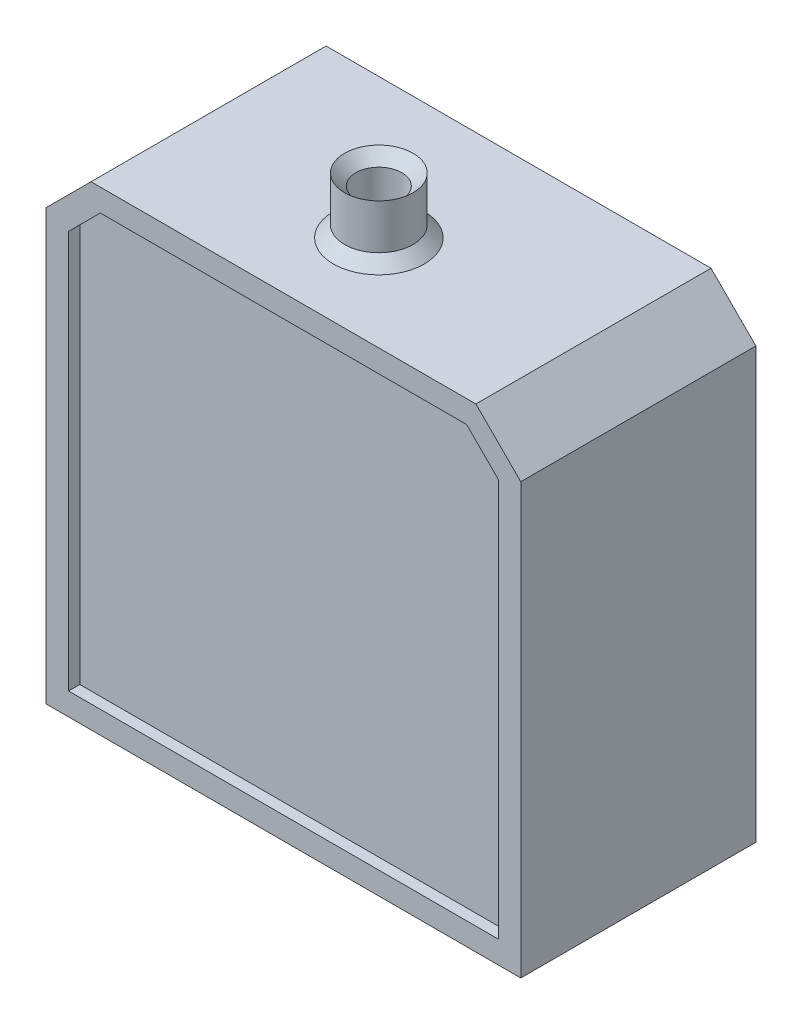
ISO-10303-21;
HEADER;
FILE_DESCRIPTION(('STEP AP214'),'2;1');
FILE_NAME('part.step','',(''),(''),'','','');
FILE_SCHEMA(('AUTOMOTIVE_DESIGN { 1 0 10303 214 1 1 1 1 }'));
ENDSEC;
DATA;
#1=APPLICATION_CONTEXT('core data for automotive mechanical design processes');
#2=APPLICATION_PROTOCOL_DEFINITION('international standard','automotive_design',2000,#1);
#3=PRODUCT_CONTEXT('',#1,'mechanical');
#4=PRODUCT('Part','Part','',(#3));
#5=PRODUCT_RELATED_PRODUCT_CATEGORY('part','',(#4));
#6=PRODUCT_DEFINITION_FORMATION('','',#4);
#7=PRODUCT_DEFINITION_CONTEXT('part definition',#1,'design');
#8=PRODUCT_DEFINITION('design','',#6,#7);
#9=PRODUCT_DEFINITION_SHAPE('','',#8);
#10=(LENGTH_UNIT() NAMED_UNIT(*) SI_UNIT(.MILLI.,.METRE.));
#11=(NAMED_UNIT(*) PLANE_ANGLE_UNIT() SI_UNIT($,.RADIAN.));
#12=(NAMED_UNIT(*) SI_UNIT($,.STERADIAN.) SOLID_ANGLE_UNIT());
#13=UNCERTAINTY_MEASURE_WITH_UNIT(LENGTH_MEASURE(1.E-05),#10,'distance_accuracy_value','');
#14=(GEOMETRIC_REPRESENTATION_CONTEXT(3) GLOBAL_UNCERTAINTY_ASSIGNED_CONTEXT((#13)) GLOBAL_UNIT_ASSIGNED_CONTEXT((#10,
#11,#12)) REPRESENTATION_CONTEXT('',''));
#15=CARTESIAN_POINT('',(0.,0.,0.));
#16=DIRECTION('',(0.,0.,1.));
#17=DIRECTION('',(1.,0.,0.));
#18=AXIS2_PLACEMENT_3D('',#15,#16,#17);
#19=CARTESIAN_POINT('',(-21.15,21.15,20.95));
#20=DIRECTION('',(0.,-1.,0.));
#21=DIRECTION('',(0.,0.,-1.));
#22=AXIS2_PLACEMENT_3D('',#19,#20,#21);
#23=PLANE('',#22);
#24=CARTESIAN_POINT('',(0.,21.15,12.45));
#25=DIRECTION('',(0.,-1.,0.));
#26=DIRECTION('',(0.,0.,-1.));
#27=AXIS2_PLACEMENT_3D('',#24,#25,#26);
#28=CIRCLE('',#27,4.04999999999999);
#29=CARTESIAN_POINT('',(0.,21.15,8.40000000000001));
#30=VERTEX_POINT('',#29);
#31=EDGE_CURVE('E44',#30,#30,#28,.T.);
#32=ORIENTED_EDGE('',*,*,#31,.T.);
#33=EDGE_LOOP('',(#32));
#34=FACE_BOUND('',#33,.T.);
#35=DIRECTION('',(-1.,0.,0.));
#36=VECTOR('',#35,1.);
#37=CARTESIAN_POINT('',(-21.15,21.15,20.95));
#38=LINE('',#37,#36);
#39=CARTESIAN_POINT('',(17.15,21.15,20.95));
#40=VERTEX_POINT('',#39);
#41=CARTESIAN_POINT('',(-17.15,21.15,20.95));
#42=VERTEX_POINT('',#41);
#43=EDGE_CURVE('E199',#40,#42,#38,.T.);
#44=ORIENTED_EDGE('',*,*,#43,.F.);
#45=DIRECTION('',(0.,0.,-1.));
#46=VECTOR('',#45,1.);
#47=CARTESIAN_POINT('',(17.15,21.15,20.95));
#48=LINE('',#47,#46);
#49=CARTESIAN_POINT('',(17.15,21.15,0.));
#50=VERTEX_POINT('',#49);
#51=EDGE_CURVE('E225',#40,#50,#48,.T.);
#52=ORIENTED_EDGE('',*,*,#51,.T.);
#53=DIRECTION('',(-1.,0.,0.));
#54=VECTOR('',#53,1.);
#55=CARTESIAN_POINT('',(-21.15,21.15,0.));
#56=LINE('',#55,#54);
#57=CARTESIAN_POINT('',(-17.15,21.15,0.));
#58=VERTEX_POINT('',#57);
#59=EDGE_CURVE('E196',#50,#58,#56,.T.);
#60=ORIENTED_EDGE('',*,*,#59,.T.);
#61=DIRECTION('',(0.,0.,1.));
#62=VECTOR('',#61,1.);
#63=CARTESIAN_POINT('',(-17.15,21.15,20.95));
#64=LINE('',#63,#62);
#65=EDGE_CURVE('E223',#58,#42,#64,.T.);
#66=ORIENTED_EDGE('',*,*,#65,.T.);
#67=EDGE_LOOP('',(#44,#52,#60,#66));
#68=FACE_BOUND('',#67,.T.);
#69=ADVANCED_FACE('F36',(#34,#68),#23,.F.);
#70=CARTESIAN_POINT('',(-21.15,-21.15,20.95));
#71=DIRECTION('',(1.,0.,0.));
#72=DIRECTION('',(0.,0.,-1.));
#73=AXIS2_PLACEMENT_3D('',#70,#71,#72);
#74=PLANE('',#73);
#75=DIRECTION('',(0.,-1.,0.));
#76=VECTOR('',#75,1.);
#77=CARTESIAN_POINT('',(-21.15,-21.15,20.95));
#78=LINE('',#77,#76);
#79=CARTESIAN_POINT('',(-21.15,17.15,20.95));
#80=VERTEX_POINT('',#79);
#81=CARTESIAN_POINT('',(-21.15,-21.15,20.95));
#82=VERTEX_POINT('',#81);
#83=EDGE_CURVE('E201',#80,#82,#78,.T.);
#84=ORIENTED_EDGE('',*,*,#83,.F.);
#85=DIRECTION('',(0.,0.,-1.));
#86=VECTOR('',#85,1.);
#87=CARTESIAN_POINT('',(-21.15,17.15,20.95));
#88=LINE('',#87,#86);
#89=CARTESIAN_POINT('',(-21.15,17.15,0.));
#90=VERTEX_POINT('',#89);
#91=EDGE_CURVE('E237',#80,#90,#88,.T.);
#92=ORIENTED_EDGE('',*,*,#91,.T.);
#93=DIRECTION('',(0.,-1.,0.));
#94=VECTOR('',#93,1.);
#95=CARTESIAN_POINT('',(-21.15,-21.15,0.));
#96=LINE('',#95,#94);
#97=CARTESIAN_POINT('',(-21.15,-21.15,0.));
#98=VERTEX_POINT('',#97);
#99=EDGE_CURVE('E212',#90,#98,#96,.T.);
#100=ORIENTED_EDGE('',*,*,#99,.T.);
#101=DIRECTION('',(0.,0.,-1.));
#102=VECTOR('',#101,1.);
#103=CARTESIAN_POINT('',(-21.15,-21.15,20.95));
#104=LINE('',#103,#102);
#105=EDGE_CURVE('E220',#82,#98,#104,.T.);
#106=ORIENTED_EDGE('',*,*,#105,.F.);
#107=EDGE_LOOP('',(#84,#92,#100,#106));
#108=FACE_BOUND('',#107,.T.);
#109=ADVANCED_FACE('F281',(#108),#74,.F.);
#110=CARTESIAN_POINT('',(21.15,-21.15,20.95));
#111=DIRECTION('',(0.,1.,0.));
#112=DIRECTION('',(0.,0.,1.));
#113=AXIS2_PLACEMENT_3D('',#110,#111,#112);
#114=PLANE('',#113);
#115=CARTESIAN_POINT('',(0.,-21.15,12.45));
#116=DIRECTION('',(0.,-1.,0.));
#117=DIRECTION('',(0.,0.,-1.));
#118=AXIS2_PLACEMENT_3D('',#115,#116,#117);
#119=CIRCLE('',#118,4.05);
#120=CARTESIAN_POINT('',(0.,-21.15,8.4));
#121=VERTEX_POINT('',#120);
#122=EDGE_CURVE('E190',#121,#121,#119,.T.);
#123=ORIENTED_EDGE('',*,*,#122,.F.);
#124=EDGE_LOOP('',(#123));
#125=FACE_BOUND('',#124,.T.);
#126=DIRECTION('',(1.,0.,0.));
#127=VECTOR('',#126,1.);
#128=CARTESIAN_POINT('',(21.15,-21.15,0.));
#129=LINE('',#128,#127);
#130=CARTESIAN_POINT('',(21.15,-21.15,0.));
#131=VERTEX_POINT('',#130);
#132=EDGE_CURVE('E214',#98,#131,#129,.T.);
#133=ORIENTED_EDGE('',*,*,#132,.T.);
#134=DIRECTION('',(0.,0.,-1.));
#135=VECTOR('',#134,1.);
#136=CARTESIAN_POINT('',(21.15,-21.15,20.95));
#137=LINE('',#136,#135);
#138=CARTESIAN_POINT('',(21.15,-21.15,20.95));
#139=VERTEX_POINT('',#138);
#140=EDGE_CURVE('E209',#139,#131,#137,.T.);
#141=ORIENTED_EDGE('',*,*,#140,.F.);
#142=DIRECTION('',(1.,0.,0.));
#143=VECTOR('',#142,1.);
#144=CARTESIAN_POINT('',(21.15,-21.15,20.95));
#145=LINE('',#144,#143);
#146=EDGE_CURVE('E204',#82,#139,#145,.T.);
#147=ORIENTED_EDGE('',*,*,#146,.F.);
#148=ORIENTED_EDGE('',*,*,#105,.T.);
#149=EDGE_LOOP('',(#133,#141,#147,#148));
#150=FACE_BOUND('',#149,.T.);
#151=ADVANCED_FACE('F286',(#125,#150),#114,.F.);
#152=CARTESIAN_POINT('',(21.15,21.15,20.95));
#153=DIRECTION('',(-1.,0.,0.));
#154=DIRECTION('',(0.,-1.,0.));
#155=AXIS2_PLACEMENT_3D('',#152,#153,#154);
#156=PLANE('',#155);
#157=DIRECTION('',(0.,1.,0.));
#158=VECTOR('',#157,1.);
#159=CARTESIAN_POINT('',(21.15,21.15,0.));
#160=LINE('',#159,#158);
#161=CARTESIAN_POINT('',(21.15,17.15,0.));
#162=VERTEX_POINT('',#161);
#163=EDGE_CURVE('E202',#131,#162,#160,.T.);
#164=ORIENTED_EDGE('',*,*,#163,.T.);
#165=DIRECTION('',(0.,0.,1.));
#166=VECTOR('',#165,1.);
#167=CARTESIAN_POINT('',(21.15,17.15,20.95));
#168=LINE('',#167,#166);
#169=CARTESIAN_POINT('',(21.15,17.15,20.95));
#170=VERTEX_POINT('',#169);
#171=EDGE_CURVE('E232',#162,#170,#168,.T.);
#172=ORIENTED_EDGE('',*,*,#171,.T.);
#173=DIRECTION('',(0.,1.,0.));
#174=VECTOR('',#173,1.);
#175=CARTESIAN_POINT('',(21.15,21.15,20.95));
#176=LINE('',#175,#174);
#177=EDGE_CURVE('E206',#139,#170,#176,.T.);
#178=ORIENTED_EDGE('',*,*,#177,.F.);
#179=ORIENTED_EDGE('',*,*,#140,.T.);
#180=EDGE_LOOP('',(#164,#172,#178,#179));
#181=FACE_BOUND('',#180,.T.);
#182=ADVANCED_FACE('F309',(#181),#156,.F.);
#183=CARTESIAN_POINT('',(0.,0.,20.95));
#184=DIRECTION('',(0.,0.,-1.));
#185=DIRECTION('',(-1.,0.,0.));
#186=AXIS2_PLACEMENT_3D('',#183,#184,#185);
#187=PLANE('',#186);
#188=DIRECTION('',(0.,1.,0.));
#189=VECTOR('',#188,1.);
#190=CARTESIAN_POINT('',(19.15,-19.15,20.95));
#191=LINE('',#190,#189);
#192=CARTESIAN_POINT('',(19.15,-19.15,20.95));
#193=VERTEX_POINT('',#192);
#194=CARTESIAN_POINT('',(19.15,16.3215728752538,20.95));
#195=VERTEX_POINT('',#194);
#196=EDGE_CURVE('E161',#193,#195,#191,.T.);
#197=ORIENTED_EDGE('',*,*,#196,.F.);
#198=DIRECTION('',(1.,0.,0.));
#199=VECTOR('',#198,1.);
#200=CARTESIAN_POINT('',(-19.15,-19.15,20.95));
#201=LINE('',#200,#199);
#202=CARTESIAN_POINT('',(-19.15,-19.15,20.95));
#203=VERTEX_POINT('',#202);
#204=EDGE_CURVE('E51',#203,#193,#201,.T.);
#205=ORIENTED_EDGE('',*,*,#204,.F.);
#206=DIRECTION('',(0.,-1.,0.));
#207=VECTOR('',#206,1.);
#208=CARTESIAN_POINT('',(-19.15,16.3215728752538,20.95));
#209=LINE('',#208,#207);
#210=CARTESIAN_POINT('',(-19.15,16.3215728752538,20.95));
#211=VERTEX_POINT('',#210);
#212=EDGE_CURVE('E147',#211,#203,#209,.T.);
#213=ORIENTED_EDGE('',*,*,#212,.F.);
#214=DIRECTION('',(-0.707106781186549,-0.707106781186546,0.));
#215=VECTOR('',#214,1.);
#216=CARTESIAN_POINT('',(-16.3215728752538,19.15,20.95));
#217=LINE('',#216,#215);
#218=CARTESIAN_POINT('',(-16.3215728752538,19.15,20.95));
#219=VERTEX_POINT('',#218);
#220=EDGE_CURVE('E150',#219,#211,#217,.T.);
#221=ORIENTED_EDGE('',*,*,#220,.F.);
#222=DIRECTION('',(-1.,0.,0.));
#223=VECTOR('',#222,1.);
#224=CARTESIAN_POINT('',(16.3215728752538,19.15,20.95));
#225=LINE('',#224,#223);
#226=CARTESIAN_POINT('',(16.3215728752538,19.15,20.95));
#227=VERTEX_POINT('',#226);
#228=EDGE_CURVE('E166',#227,#219,#225,.T.);
#229=ORIENTED_EDGE('',*,*,#228,.F.);
#230=DIRECTION('',(-0.707106781186546,0.707106781186549,0.));
#231=VECTOR('',#230,1.);
#232=CARTESIAN_POINT('',(19.15,16.3215728752538,20.95));
#233=LINE('',#232,#231);
#234=EDGE_CURVE('E163',#195,#227,#233,.T.);
#235=ORIENTED_EDGE('',*,*,#234,.F.);
#236=EDGE_LOOP('',(#197,#205,#213,#221,#229,#235));
#237=FACE_BOUND('',#236,.T.);
#238=ORIENTED_EDGE('',*,*,#177,.T.);
#239=DIRECTION('',(0.707106781186546,-0.707106781186549,0.));
#240=VECTOR('',#239,1.);
#241=CARTESIAN_POINT('',(17.15,21.15,20.95));
#242=LINE('',#241,#240);
#243=EDGE_CURVE('E235',#170,#40,#242,.F.);
#244=ORIENTED_EDGE('',*,*,#243,.T.);
#245=ORIENTED_EDGE('',*,*,#43,.T.);
#246=DIRECTION('',(0.707106781186549,0.707106781186546,0.));
#247=VECTOR('',#246,1.);
#248=CARTESIAN_POINT('',(-21.15,17.15,20.95));
#249=LINE('',#248,#247);
#250=EDGE_CURVE('E59',#42,#80,#249,.F.);
#251=ORIENTED_EDGE('',*,*,#250,.T.);
#252=ORIENTED_EDGE('',*,*,#83,.T.);
#253=ORIENTED_EDGE('',*,*,#146,.T.);
#254=EDGE_LOOP('',(#238,#244,#245,#251,#252,#253));
#255=FACE_BOUND('',#254,.T.);
#256=ADVANCED_FACE('F312',(#237,#255),#187,.F.);
#257=CARTESIAN_POINT('',(0.,0.,0.));
#258=DIRECTION('',(0.,0.,-1.));
#259=DIRECTION('',(-1.,0.,0.));
#260=AXIS2_PLACEMENT_3D('',#257,#258,#259);
#261=PLANE('',#260);
#262=CARTESIAN_POINT('',(0.,0.,0.));
#263=DIRECTION('',(0.,0.,1.));
#264=DIRECTION('',(1.,0.,0.));
#265=AXIS2_PLACEMENT_3D('',#262,#263,#264);
#266=CIRCLE('',#265,2.5);
#267=CARTESIAN_POINT('',(2.5,0.,0.));
#268=VERTEX_POINT('',#267);
#269=EDGE_CURVE('E186',#268,#268,#266,.T.);
#270=ORIENTED_EDGE('',*,*,#269,.T.);
#271=EDGE_LOOP('',(#270));
#272=FACE_BOUND('',#271,.T.);
#273=ORIENTED_EDGE('',*,*,#59,.F.);
#274=DIRECTION('',(-0.707106781186546,0.707106781186549,0.));
#275=VECTOR('',#274,1.);
#276=CARTESIAN_POINT('',(19.15,19.1499999999999,0.));
#277=LINE('',#276,#275);
#278=EDGE_CURVE('E230',#50,#162,#277,.F.);
#279=ORIENTED_EDGE('',*,*,#278,.T.);
#280=ORIENTED_EDGE('',*,*,#163,.F.);
#281=ORIENTED_EDGE('',*,*,#132,.F.);
#282=ORIENTED_EDGE('',*,*,#99,.F.);
#283=DIRECTION('',(-0.707106781186549,-0.707106781186546,0.));
#284=VECTOR('',#283,1.);
#285=CARTESIAN_POINT('',(-19.1499999999999,19.15,0.));
#286=LINE('',#285,#284);
#287=EDGE_CURVE('E228',#90,#58,#286,.F.);
#288=ORIENTED_EDGE('',*,*,#287,.T.);
#289=EDGE_LOOP('',(#273,#279,#280,#281,#282,#288));
#290=FACE_BOUND('',#289,.T.);
#291=ADVANCED_FACE('F302',(#272,#290),#261,.T.);
#292=CARTESIAN_POINT('',(0.,-16.15,12.45));
#293=DIRECTION('',(0.,-1.,0.));
#294=DIRECTION('',(0.,0.,-1.));
#295=AXIS2_PLACEMENT_3D('',#292,#293,#294);
#296=CYLINDRICAL_SURFACE('',#295,4.05);
#297=CARTESIAN_POINT('',(0.,-16.15,12.45));
#298=DIRECTION('',(0.,-1.,0.));
#299=DIRECTION('',(0.,0.,-1.));
#300=AXIS2_PLACEMENT_3D('',#297,#298,#299);
#301=CIRCLE('',#300,4.05);
#302=CARTESIAN_POINT('',(0.,-16.15,8.4));
#303=VERTEX_POINT('',#302);
#304=EDGE_CURVE('E193',#303,#303,#301,.T.);
#305=ORIENTED_EDGE('',*,*,#304,.F.);
#306=EDGE_LOOP('',(#305));
#307=FACE_BOUND('',#306,.T.);
#308=ORIENTED_EDGE('',*,*,#122,.T.);
#309=EDGE_LOOP('',(#308));
#310=FACE_BOUND('',#309,.T.);
#311=ADVANCED_FACE('F322',(#307,#310),#296,.F.);
#312=CARTESIAN_POINT('',(0.,-16.15,12.45));
#313=DIRECTION('',(0.,-1.,0.));
#314=DIRECTION('',(0.,0.,-1.));
#315=AXIS2_PLACEMENT_3D('',#312,#313,#314);
#316=PLANE('',#315);
#317=ORIENTED_EDGE('',*,*,#304,.T.);
#318=EDGE_LOOP('',(#317));
#319=FACE_BOUND('',#318,.T.);
#320=ADVANCED_FACE('F335',(#319),#316,.T.);
#321=CARTESIAN_POINT('',(0.,0.,8.5));
#322=DIRECTION('',(0.,0.,-1.));
#323=DIRECTION('',(-1.,0.,0.));
#324=AXIS2_PLACEMENT_3D('',#321,#322,#323);
#325=CYLINDRICAL_SURFACE('',#324,2.5);
#326=CARTESIAN_POINT('',(0.,0.,8.5));
#327=DIRECTION('',(0.,0.,1.));
#328=DIRECTION('',(1.,0.,0.));
#329=AXIS2_PLACEMENT_3D('',#326,#327,#328);
#330=CIRCLE('',#329,2.5);
#331=CARTESIAN_POINT('',(2.5,0.,8.5));
#332=VERTEX_POINT('',#331);
#333=EDGE_CURVE('E187',#332,#332,#330,.T.);
#334=ORIENTED_EDGE('',*,*,#333,.T.);
#335=EDGE_LOOP('',(#334));
#336=FACE_BOUND('',#335,.T.);
#337=ORIENTED_EDGE('',*,*,#269,.F.);
#338=EDGE_LOOP('',(#337));
#339=FACE_BOUND('',#338,.T.);
#340=ADVANCED_FACE('F340',(#336,#339),#325,.F.);
#341=CARTESIAN_POINT('',(0.,0.,8.5));
#342=DIRECTION('',(0.,0.,1.));
#343=DIRECTION('',(1.,0.,0.));
#344=AXIS2_PLACEMENT_3D('',#341,#342,#343);
#345=PLANE('',#344);
#346=ORIENTED_EDGE('',*,*,#333,.F.);
#347=EDGE_LOOP('',(#346));
#348=FACE_BOUND('',#347,.T.);
#349=ADVANCED_FACE('F257',(#348),#345,.F.);
#350=CARTESIAN_POINT('',(0.,26.15,12.45));
#351=DIRECTION('',(0.,-1.,0.));
#352=DIRECTION('',(0.,0.,-1.));
#353=AXIS2_PLACEMENT_3D('',#350,#351,#352);
#354=CYLINDRICAL_SURFACE('',#353,3.05);
#355=CARTESIAN_POINT('',(0.,22.15,12.45));
#356=DIRECTION('',(0.,-1.,0.));
#357=DIRECTION('',(0.,0.,-1.));
#358=AXIS2_PLACEMENT_3D('',#355,#356,#357);
#359=CIRCLE('',#358,3.05);
#360=CARTESIAN_POINT('',(0.,22.15,9.4));
#361=VERTEX_POINT('',#360);
#362=EDGE_CURVE('E240',#361,#361,#359,.F.);
#363=ORIENTED_EDGE('',*,*,#362,.T.);
#364=EDGE_LOOP('',(#363));
#365=FACE_BOUND('',#364,.T.);
#366=CARTESIAN_POINT('',(0.,26.15,12.45));
#367=DIRECTION('',(0.,1.,0.));
#368=DIRECTION('',(0.,0.,1.));
#369=AXIS2_PLACEMENT_3D('',#366,#367,#368);
#370=CIRCLE('',#369,3.05);
#371=CARTESIAN_POINT('',(0.,26.15,15.5));
#372=VERTEX_POINT('',#371);
#373=EDGE_CURVE('E183',#372,#372,#370,.T.);
#374=ORIENTED_EDGE('',*,*,#373,.F.);
#375=EDGE_LOOP('',(#374));
#376=FACE_BOUND('',#375,.T.);
#377=ADVANCED_FACE('F253',(#365,#376),#354,.T.);
#378=CARTESIAN_POINT('',(0.,6.15,12.45));
#379=DIRECTION('',(0.,1.,0.));
#380=DIRECTION('',(0.,0.,1.));
#381=AXIS2_PLACEMENT_3D('',#378,#379,#380);
#382=CYLINDRICAL_SURFACE('',#381,2.05);
#383=CARTESIAN_POINT('',(0.,25.15,12.45));
#384=DIRECTION('',(0.,1.,0.));
#385=DIRECTION('',(0.,0.,1.));
#386=AXIS2_PLACEMENT_3D('',#383,#384,#385);
#387=CIRCLE('',#386,2.05);
#388=CARTESIAN_POINT('',(0.,25.15,14.5));
#389=VERTEX_POINT('',#388);
#390=EDGE_CURVE('E11',#389,#389,#387,.T.);
#391=ORIENTED_EDGE('',*,*,#390,.T.);
#392=EDGE_LOOP('',(#391));
#393=FACE_BOUND('',#392,.T.);
#394=CARTESIAN_POINT('',(0.,6.15,12.45));
#395=DIRECTION('',(0.,1.,0.));
#396=DIRECTION('',(0.,0.,1.));
#397=AXIS2_PLACEMENT_3D('',#394,#395,#396);
#398=CIRCLE('',#397,2.05);
#399=CARTESIAN_POINT('',(0.,6.15,14.5));
#400=VERTEX_POINT('',#399);
#401=EDGE_CURVE('E173',#400,#400,#398,.T.);
#402=ORIENTED_EDGE('',*,*,#401,.F.);
#403=EDGE_LOOP('',(#402));
#404=FACE_BOUND('',#403,.T.);
#405=ADVANCED_FACE('F256',(#393,#404),#382,.F.);
#406=CARTESIAN_POINT('',(0.,6.15,12.45));
#407=DIRECTION('',(0.,1.,0.));
#408=DIRECTION('',(0.,0.,1.));
#409=AXIS2_PLACEMENT_3D('',#406,#407,#408);
#410=PLANE('',#409);
#411=ORIENTED_EDGE('',*,*,#401,.T.);
#412=EDGE_LOOP('',(#411));
#413=FACE_BOUND('',#412,.T.);
#414=ADVANCED_FACE('F267',(#413),#410,.T.);
#415=CARTESIAN_POINT('',(17.15,21.15,20.95));
#416=DIRECTION('',(-0.707106781186549,-0.707106781186546,0.));
#417=DIRECTION('',(0.,0.,-1.));
#418=AXIS2_PLACEMENT_3D('',#415,#416,#417);
#419=PLANE('',#418);
#420=ORIENTED_EDGE('',*,*,#243,.F.);
#421=ORIENTED_EDGE('',*,*,#171,.F.);
#422=ORIENTED_EDGE('',*,*,#278,.F.);
#423=ORIENTED_EDGE('',*,*,#51,.F.);
#424=EDGE_LOOP('',(#420,#421,#422,#423));
#425=FACE_BOUND('',#424,.T.);
#426=ADVANCED_FACE('F272',(#425),#419,.F.);
#427=CARTESIAN_POINT('',(-21.15,17.15,20.95));
#428=DIRECTION('',(0.707106781186546,-0.707106781186549,0.));
#429=DIRECTION('',(0.,0.,-1.));
#430=AXIS2_PLACEMENT_3D('',#427,#428,#429);
#431=PLANE('',#430);
#432=ORIENTED_EDGE('',*,*,#250,.F.);
#433=ORIENTED_EDGE('',*,*,#65,.F.);
#434=ORIENTED_EDGE('',*,*,#287,.F.);
#435=ORIENTED_EDGE('',*,*,#91,.F.);
#436=EDGE_LOOP('',(#432,#433,#434,#435));
#437=FACE_BOUND('',#436,.T.);
#438=ADVANCED_FACE('F250',(#437),#431,.F.);
#439=CARTESIAN_POINT('',(0.,22.15,12.45));
#440=DIRECTION('',(0.,-1.,0.));
#441=DIRECTION('',(0.,0.,-1.));
#442=AXIS2_PLACEMENT_3D('',#439,#440,#441);
#443=CONICAL_SURFACE('',#442,3.05,0.785398163397447);
#444=ORIENTED_EDGE('',*,*,#31,.F.);
#445=EDGE_LOOP('',(#444));
#446=FACE_BOUND('',#445,.T.);
#447=ORIENTED_EDGE('',*,*,#362,.F.);
#448=EDGE_LOOP('',(#447));
#449=FACE_BOUND('',#448,.T.);
#450=ADVANCED_FACE('F247',(#446,#449),#443,.T.);
#451=CARTESIAN_POINT('',(0.,25.15,12.45));
#452=DIRECTION('',(0.,1.,0.));
#453=DIRECTION('',(0.,0.,1.));
#454=AXIS2_PLACEMENT_3D('',#451,#452,#453);
#455=CONICAL_SURFACE('',#454,2.05,0.785398163397451);
#456=ORIENTED_EDGE('',*,*,#373,.T.);
#457=EDGE_LOOP('',(#456));
#458=FACE_BOUND('',#457,.T.);
#459=ORIENTED_EDGE('',*,*,#390,.F.);
#460=EDGE_LOOP('',(#459));
#461=FACE_BOUND('',#460,.T.);
#462=ADVANCED_FACE('F38',(#458,#461),#455,.F.);
#463=CARTESIAN_POINT('',(-19.15,-19.15,19.95));
#464=DIRECTION('',(0.,-1.,0.));
#465=DIRECTION('',(0.,0.,-1.));
#466=AXIS2_PLACEMENT_3D('',#463,#464,#465);
#467=PLANE('',#466);
#468=ORIENTED_EDGE('',*,*,#204,.T.);
#469=DIRECTION('',(0.,0.,1.));
#470=VECTOR('',#469,1.);
#471=CARTESIAN_POINT('',(19.15,-19.15,19.95));
#472=LINE('',#471,#470);
#473=CARTESIAN_POINT('',(19.15,-19.15,19.95));
#474=VERTEX_POINT('',#473);
#475=EDGE_CURVE('E124',#474,#193,#472,.T.);
#476=ORIENTED_EDGE('',*,*,#475,.F.);
#477=DIRECTION('',(1.,0.,0.));
#478=VECTOR('',#477,1.);
#479=CARTESIAN_POINT('',(-19.15,-19.15,19.95));
#480=LINE('',#479,#478);
#481=CARTESIAN_POINT('',(-19.15,-19.15,19.95));
#482=VERTEX_POINT('',#481);
#483=EDGE_CURVE('E128',#482,#474,#480,.T.);
#484=ORIENTED_EDGE('',*,*,#483,.F.);
#485=DIRECTION('',(0.,0.,1.));
#486=VECTOR('',#485,1.);
#487=CARTESIAN_POINT('',(-19.15,-19.15,19.95));
#488=LINE('',#487,#486);
#489=EDGE_CURVE('E171',#482,#203,#488,.T.);
#490=ORIENTED_EDGE('',*,*,#489,.T.);
#491=EDGE_LOOP('',(#468,#476,#484,#490));
#492=FACE_BOUND('',#491,.T.);
#493=ADVANCED_FACE('F126',(#492),#467,.F.);
#494=CARTESIAN_POINT('',(-19.15,16.3215728752538,19.95));
#495=DIRECTION('',(-1.,0.,0.));
#496=DIRECTION('',(0.,0.,1.));
#497=AXIS2_PLACEMENT_3D('',#494,#495,#496);
#498=PLANE('',#497);
#499=ORIENTED_EDGE('',*,*,#212,.T.);
#500=ORIENTED_EDGE('',*,*,#489,.F.);
#501=DIRECTION('',(0.,-1.,0.));
#502=VECTOR('',#501,1.);
#503=CARTESIAN_POINT('',(-19.15,16.3215728752538,19.95));
#504=LINE('',#503,#502);
#505=CARTESIAN_POINT('',(-19.15,16.3215728752538,19.95));
#506=VERTEX_POINT('',#505);
#507=EDGE_CURVE('E134',#506,#482,#504,.T.);
#508=ORIENTED_EDGE('',*,*,#507,.F.);
#509=DIRECTION('',(0.,0.,1.));
#510=VECTOR('',#509,1.);
#511=CARTESIAN_POINT('',(-19.15,16.3215728752538,19.95));
#512=LINE('',#511,#510);
#513=EDGE_CURVE('E174',#506,#211,#512,.T.);
#514=ORIENTED_EDGE('',*,*,#513,.T.);
#515=EDGE_LOOP('',(#499,#500,#508,#514));
#516=FACE_BOUND('',#515,.T.);
#517=ADVANCED_FACE('F395',(#516),#498,.F.);
#518=CARTESIAN_POINT('',(-16.3215728752538,19.15,19.95));
#519=DIRECTION('',(-0.707106781186546,0.707106781186549,0.));
#520=DIRECTION('',(-0.707106781186549,-0.707106781186546,0.));
#521=AXIS2_PLACEMENT_3D('',#518,#519,#520);
#522=PLANE('',#521);
#523=ORIENTED_EDGE('',*,*,#220,.T.);
#524=ORIENTED_EDGE('',*,*,#513,.F.);
#525=DIRECTION('',(-0.707106781186549,-0.707106781186546,0.));
#526=VECTOR('',#525,1.);
#527=CARTESIAN_POINT('',(-16.3215728752538,19.15,19.95));
#528=LINE('',#527,#526);
#529=CARTESIAN_POINT('',(-16.3215728752538,19.15,19.95));
#530=VERTEX_POINT('',#529);
#531=EDGE_CURVE('E157',#530,#506,#528,.T.);
#532=ORIENTED_EDGE('',*,*,#531,.F.);
#533=DIRECTION('',(0.,0.,1.));
#534=VECTOR('',#533,1.);
#535=CARTESIAN_POINT('',(-16.3215728752538,19.15,19.95));
#536=LINE('',#535,#534);
#537=EDGE_CURVE('E176',#530,#219,#536,.T.);
#538=ORIENTED_EDGE('',*,*,#537,.T.);
#539=EDGE_LOOP('',(#523,#524,#532,#538));
#540=FACE_BOUND('',#539,.T.);
#541=ADVANCED_FACE('F403',(#540),#522,.F.);
#542=CARTESIAN_POINT('',(16.3215728752538,19.15,19.95));
#543=DIRECTION('',(0.,1.,0.));
#544=DIRECTION('',(0.,0.,1.));
#545=AXIS2_PLACEMENT_3D('',#542,#543,#544);
#546=PLANE('',#545);
#547=ORIENTED_EDGE('',*,*,#228,.T.);
#548=ORIENTED_EDGE('',*,*,#537,.F.);
#549=DIRECTION('',(-1.,0.,0.));
#550=VECTOR('',#549,1.);
#551=CARTESIAN_POINT('',(16.3215728752538,19.15,19.95));
#552=LINE('',#551,#550);
#553=CARTESIAN_POINT('',(16.3215728752538,19.15,19.95));
#554=VERTEX_POINT('',#553);
#555=EDGE_CURVE('E154',#554,#530,#552,.T.);
#556=ORIENTED_EDGE('',*,*,#555,.F.);
#557=DIRECTION('',(0.,0.,1.));
#558=VECTOR('',#557,1.);
#559=CARTESIAN_POINT('',(16.3215728752538,19.15,19.95));
#560=LINE('',#559,#558);
#561=EDGE_CURVE('E178',#554,#227,#560,.T.);
#562=ORIENTED_EDGE('',*,*,#561,.T.);
#563=EDGE_LOOP('',(#547,#548,#556,#562));
#564=FACE_BOUND('',#563,.T.);
#565=ADVANCED_FACE('F413',(#564),#546,.F.);
#566=CARTESIAN_POINT('',(19.15,16.3215728752538,19.95));
#567=DIRECTION('',(0.707106781186549,0.707106781186546,0.));
#568=DIRECTION('',(-0.707106781186546,0.707106781186549,0.));
#569=AXIS2_PLACEMENT_3D('',#566,#567,#568);
#570=PLANE('',#569);
#571=ORIENTED_EDGE('',*,*,#234,.T.);
#572=ORIENTED_EDGE('',*,*,#561,.F.);
#573=DIRECTION('',(-0.707106781186546,0.707106781186549,0.));
#574=VECTOR('',#573,1.);
#575=CARTESIAN_POINT('',(19.15,16.3215728752538,19.95));
#576=LINE('',#575,#574);
#577=CARTESIAN_POINT('',(19.15,16.3215728752538,19.95));
#578=VERTEX_POINT('',#577);
#579=EDGE_CURVE('E142',#578,#554,#576,.T.);
#580=ORIENTED_EDGE('',*,*,#579,.F.);
#581=DIRECTION('',(0.,0.,1.));
#582=VECTOR('',#581,1.);
#583=CARTESIAN_POINT('',(19.15,16.3215728752538,19.95));
#584=LINE('',#583,#582);
#585=EDGE_CURVE('E133',#578,#195,#584,.T.);
#586=ORIENTED_EDGE('',*,*,#585,.T.);
#587=EDGE_LOOP('',(#571,#572,#580,#586));
#588=FACE_BOUND('',#587,.T.);
#589=ADVANCED_FACE('F423',(#588),#570,.F.);
#590=CARTESIAN_POINT('',(19.15,-19.15,19.95));
#591=DIRECTION('',(1.,0.,0.));
#592=DIRECTION('',(0.,1.,0.));
#593=AXIS2_PLACEMENT_3D('',#590,#591,#592);
#594=PLANE('',#593);
#595=ORIENTED_EDGE('',*,*,#196,.T.);
#596=ORIENTED_EDGE('',*,*,#585,.F.);
#597=DIRECTION('',(0.,1.,0.));
#598=VECTOR('',#597,1.);
#599=CARTESIAN_POINT('',(19.15,-19.15,19.95));
#600=LINE('',#599,#598);
#601=EDGE_CURVE('E137',#474,#578,#600,.T.);
#602=ORIENTED_EDGE('',*,*,#601,.F.);
#603=ORIENTED_EDGE('',*,*,#475,.T.);
#604=EDGE_LOOP('',(#595,#596,#602,#603));
#605=FACE_BOUND('',#604,.T.);
#606=ADVANCED_FACE('F138',(#605),#594,.F.);
#607=CARTESIAN_POINT('',(0.,0.,19.95));
#608=DIRECTION('',(0.,0.,1.));
#609=DIRECTION('',(1.,0.,0.));
#610=AXIS2_PLACEMENT_3D('',#607,#608,#609);
#611=PLANE('',#610);
#612=ORIENTED_EDGE('',*,*,#483,.T.);
#613=ORIENTED_EDGE('',*,*,#601,.T.);
#614=ORIENTED_EDGE('',*,*,#579,.T.);
#615=ORIENTED_EDGE('',*,*,#555,.T.);
#616=ORIENTED_EDGE('',*,*,#531,.T.);
#617=ORIENTED_EDGE('',*,*,#507,.T.);
#618=EDGE_LOOP('',(#612,#613,#614,#615,#616,#617));
#619=FACE_BOUND('',#618,.T.);
#620=ADVANCED_FACE('F144',(#619),#611,.T.);
#621=CLOSED_SHELL('',(#69,#109,#151,#182,#256,#291,#311,#320,#340,#349,#377,#405,#414,#426,#438,
#450,#462,#493,#517,#541,#565,#589,#606,#620));
#622=MANIFOLD_SOLID_BREP('B2',#621);
#623=ADVANCED_BREP_SHAPE_REPRESENTATION('',(#18,#622),#14);
#624=SHAPE_DEFINITION_REPRESENTATION(#9,#623);
ENDSEC;
END-ISO-10303-21;
